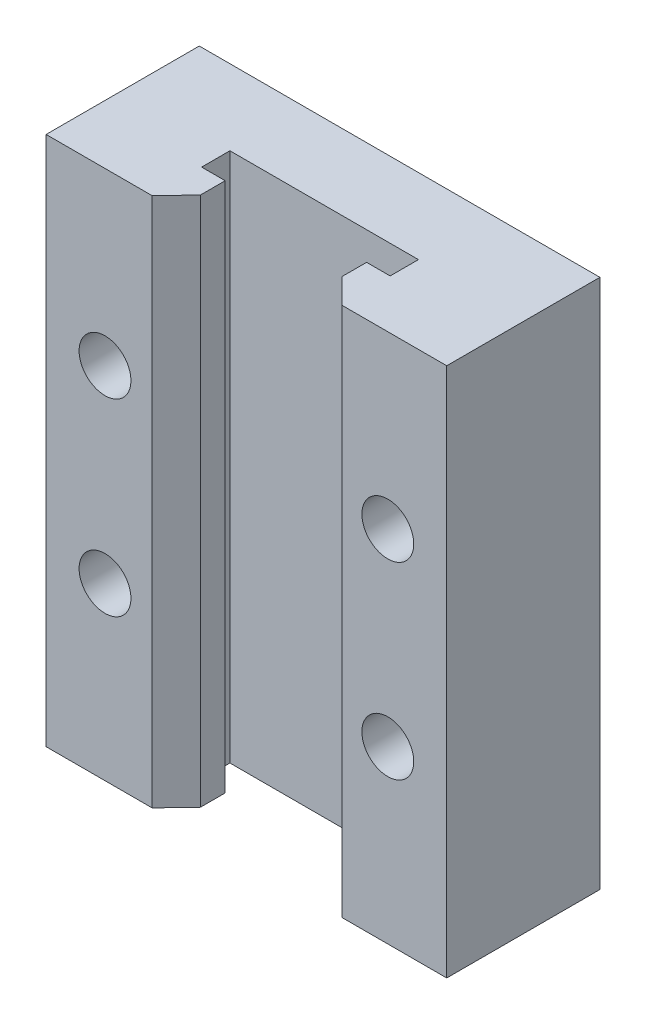
ISO-10303-21;
HEADER;
FILE_DESCRIPTION(('STEP AP214'),'2;1');
FILE_NAME('part.step','',(''),(''),'','','');
FILE_SCHEMA(('AUTOMOTIVE_DESIGN { 1 0 10303 214 1 1 1 1 }'));
ENDSEC;
DATA;
#1=APPLICATION_CONTEXT('core data for automotive mechanical design processes');
#2=APPLICATION_PROTOCOL_DEFINITION('international standard','automotive_design',2000,#1);
#3=PRODUCT_CONTEXT('',#1,'mechanical');
#4=PRODUCT('Part','Part','',(#3));
#5=PRODUCT_RELATED_PRODUCT_CATEGORY('part','',(#4));
#6=PRODUCT_DEFINITION_FORMATION('','',#4);
#7=PRODUCT_DEFINITION_CONTEXT('part definition',#1,'design');
#8=PRODUCT_DEFINITION('design','',#6,#7);
#9=PRODUCT_DEFINITION_SHAPE('','',#8);
#10=(LENGTH_UNIT() NAMED_UNIT(*) SI_UNIT(.MILLI.,.METRE.));
#11=(NAMED_UNIT(*) PLANE_ANGLE_UNIT() SI_UNIT($,.RADIAN.));
#12=(NAMED_UNIT(*) SI_UNIT($,.STERADIAN.) SOLID_ANGLE_UNIT());
#13=UNCERTAINTY_MEASURE_WITH_UNIT(LENGTH_MEASURE(1.E-05),#10,'distance_accuracy_value','');
#14=(GEOMETRIC_REPRESENTATION_CONTEXT(3) GLOBAL_UNCERTAINTY_ASSIGNED_CONTEXT((#13)) GLOBAL_UNIT_ASSIGNED_CONTEXT((#10,
#11,#12)) REPRESENTATION_CONTEXT('',''));
#15=CARTESIAN_POINT('',(0.,0.,0.));
#16=DIRECTION('',(0.,0.,1.));
#17=DIRECTION('',(1.,0.,0.));
#18=AXIS2_PLACEMENT_3D('',#15,#16,#17);
#19=CARTESIAN_POINT('',(-4.,22.5,-2.02488312466121));
#20=DIRECTION('',(-1.,0.,0.));
#21=DIRECTION('',(0.,0.,1.));
#22=AXIS2_PLACEMENT_3D('',#19,#20,#21);
#23=PLANE('',#22);
#24=DIRECTION('',(0.,0.,-1.));
#25=VECTOR('',#24,1.);
#26=CARTESIAN_POINT('',(-4.,0.,-2.02488312466121));
#27=LINE('',#26,#25);
#28=CARTESIAN_POINT('',(-4.,0.,-0.824883124661214));
#29=VERTEX_POINT('',#28);
#30=CARTESIAN_POINT('',(-4.,0.,-2.02488312466121));
#31=VERTEX_POINT('',#30);
#32=EDGE_CURVE('E171',#29,#31,#27,.T.);
#33=ORIENTED_EDGE('',*,*,#32,.T.);
#34=DIRECTION('',(0.,-1.,0.));
#35=VECTOR('',#34,1.);
#36=CARTESIAN_POINT('',(-4.,22.5,-2.02488312466121));
#37=LINE('',#36,#35);
#38=CARTESIAN_POINT('',(-4.,22.5,-2.02488312466121));
#39=VERTEX_POINT('',#38);
#40=EDGE_CURVE('E11',#39,#31,#37,.T.);
#41=ORIENTED_EDGE('',*,*,#40,.F.);
#42=DIRECTION('',(0.,0.,-1.));
#43=VECTOR('',#42,1.);
#44=CARTESIAN_POINT('',(-4.,22.5,-2.02488312466121));
#45=LINE('',#44,#43);
#46=CARTESIAN_POINT('',(-4.,22.5,-0.824883124661214));
#47=VERTEX_POINT('',#46);
#48=EDGE_CURVE('E198',#47,#39,#45,.T.);
#49=ORIENTED_EDGE('',*,*,#48,.F.);
#50=DIRECTION('',(0.,-1.,0.));
#51=VECTOR('',#50,1.);
#52=CARTESIAN_POINT('',(-4.,22.5,-0.824883124661214));
#53=LINE('',#52,#51);
#54=EDGE_CURVE('E167',#47,#29,#53,.T.);
#55=ORIENTED_EDGE('',*,*,#54,.T.);
#56=EDGE_LOOP('',(#33,#41,#49,#55));
#57=FACE_BOUND('',#56,.T.);
#58=ADVANCED_FACE('F37',(#57),#23,.F.);
#59=CARTESIAN_POINT('',(4.,22.5,-2.02488312466121));
#60=DIRECTION('',(0.,0.,-1.));
#61=DIRECTION('',(-1.,0.,0.));
#62=AXIS2_PLACEMENT_3D('',#59,#60,#61);
#63=PLANE('',#62);
#64=DIRECTION('',(1.,0.,0.));
#65=VECTOR('',#64,1.);
#66=CARTESIAN_POINT('',(4.,0.,-2.02488312466121));
#67=LINE('',#66,#65);
#68=CARTESIAN_POINT('',(4.,0.,-2.02488312466121));
#69=VERTEX_POINT('',#68);
#70=EDGE_CURVE('E174',#31,#69,#67,.T.);
#71=ORIENTED_EDGE('',*,*,#70,.T.);
#72=DIRECTION('',(0.,-1.,0.));
#73=VECTOR('',#72,1.);
#74=CARTESIAN_POINT('',(4.,22.5,-2.02488312466121));
#75=LINE('',#74,#73);
#76=CARTESIAN_POINT('',(4.,22.5,-2.02488312466121));
#77=VERTEX_POINT('',#76);
#78=EDGE_CURVE('E46',#77,#69,#75,.T.);
#79=ORIENTED_EDGE('',*,*,#78,.F.);
#80=DIRECTION('',(1.,0.,0.));
#81=VECTOR('',#80,1.);
#82=CARTESIAN_POINT('',(4.,22.5,-2.02488312466121));
#83=LINE('',#82,#81);
#84=EDGE_CURVE('E116',#39,#77,#83,.T.);
#85=ORIENTED_EDGE('',*,*,#84,.F.);
#86=ORIENTED_EDGE('',*,*,#40,.T.);
#87=EDGE_LOOP('',(#71,#79,#85,#86));
#88=FACE_BOUND('',#87,.T.);
#89=ADVANCED_FACE('F295',(#88),#63,.F.);
#90=CARTESIAN_POINT('',(4.,22.5,-2.02488312466121));
#91=DIRECTION('',(1.,0.,0.));
#92=DIRECTION('',(0.,0.,-1.));
#93=AXIS2_PLACEMENT_3D('',#90,#91,#92);
#94=PLANE('',#93);
#95=DIRECTION('',(0.,0.,1.));
#96=VECTOR('',#95,1.);
#97=CARTESIAN_POINT('',(4.,0.,-2.02488312466121));
#98=LINE('',#97,#96);
#99=CARTESIAN_POINT('',(4.,0.,-0.824883124661215));
#100=VERTEX_POINT('',#99);
#101=EDGE_CURVE('E177',#69,#100,#98,.T.);
#102=ORIENTED_EDGE('',*,*,#101,.T.);
#103=DIRECTION('',(0.,-1.,0.));
#104=VECTOR('',#103,1.);
#105=CARTESIAN_POINT('',(4.,22.5,-0.824883124661215));
#106=LINE('',#105,#104);
#107=CARTESIAN_POINT('',(4.,22.5,-0.824883124661215));
#108=VERTEX_POINT('',#107);
#109=EDGE_CURVE('E223',#108,#100,#106,.T.);
#110=ORIENTED_EDGE('',*,*,#109,.F.);
#111=DIRECTION('',(0.,0.,1.));
#112=VECTOR('',#111,1.);
#113=CARTESIAN_POINT('',(4.,22.5,-2.02488312466121));
#114=LINE('',#113,#112);
#115=EDGE_CURVE('E252',#77,#108,#114,.T.);
#116=ORIENTED_EDGE('',*,*,#115,.F.);
#117=ORIENTED_EDGE('',*,*,#78,.T.);
#118=EDGE_LOOP('',(#102,#110,#116,#117));
#119=FACE_BOUND('',#118,.T.);
#120=ADVANCED_FACE('F299',(#119),#94,.F.);
#121=CARTESIAN_POINT('',(4.,22.5,-0.824883124661215));
#122=DIRECTION('',(0.,0.,1.));
#123=DIRECTION('',(1.,0.,0.));
#124=AXIS2_PLACEMENT_3D('',#121,#122,#123);
#125=PLANE('',#124);
#126=DIRECTION('',(-1.,0.,0.));
#127=VECTOR('',#126,1.);
#128=CARTESIAN_POINT('',(4.,0.,-0.824883124661215));
#129=LINE('',#128,#127);
#130=CARTESIAN_POINT('',(3.,0.,-0.824883124661214));
#131=VERTEX_POINT('',#130);
#132=EDGE_CURVE('E179',#100,#131,#129,.T.);
#133=ORIENTED_EDGE('',*,*,#132,.T.);
#134=DIRECTION('',(0.,-1.,0.));
#135=VECTOR('',#134,1.);
#136=CARTESIAN_POINT('',(3.,22.5,-0.824883124661214));
#137=LINE('',#136,#135);
#138=CARTESIAN_POINT('',(3.,22.5,-0.824883124661214));
#139=VERTEX_POINT('',#138);
#140=EDGE_CURVE('E220',#139,#131,#137,.T.);
#141=ORIENTED_EDGE('',*,*,#140,.F.);
#142=DIRECTION('',(-1.,0.,0.));
#143=VECTOR('',#142,1.);
#144=CARTESIAN_POINT('',(4.,22.5,-0.824883124661215));
#145=LINE('',#144,#143);
#146=EDGE_CURVE('E254',#108,#139,#145,.T.);
#147=ORIENTED_EDGE('',*,*,#146,.F.);
#148=ORIENTED_EDGE('',*,*,#109,.T.);
#149=EDGE_LOOP('',(#133,#141,#147,#148));
#150=FACE_BOUND('',#149,.T.);
#151=ADVANCED_FACE('F303',(#150),#125,.F.);
#152=CARTESIAN_POINT('',(3.,22.5,-0.824883124661214));
#153=DIRECTION('',(1.,0.,0.));
#154=DIRECTION('',(0.,0.,-1.));
#155=AXIS2_PLACEMENT_3D('',#152,#153,#154);
#156=PLANE('',#155);
#157=DIRECTION('',(0.,0.,1.));
#158=VECTOR('',#157,1.);
#159=CARTESIAN_POINT('',(3.,0.,-0.824883124661214));
#160=LINE('',#159,#158);
#161=CARTESIAN_POINT('',(3.,0.,0.225116875338785));
#162=VERTEX_POINT('',#161);
#163=EDGE_CURVE('E181',#131,#162,#160,.T.);
#164=ORIENTED_EDGE('',*,*,#163,.T.);
#165=DIRECTION('',(0.,-1.,0.));
#166=VECTOR('',#165,1.);
#167=CARTESIAN_POINT('',(3.,22.5,0.225116875338785));
#168=LINE('',#167,#166);
#169=CARTESIAN_POINT('',(3.,22.5,0.225116875338785));
#170=VERTEX_POINT('',#169);
#171=EDGE_CURVE('E217',#170,#162,#168,.T.);
#172=ORIENTED_EDGE('',*,*,#171,.F.);
#173=DIRECTION('',(0.,0.,1.));
#174=VECTOR('',#173,1.);
#175=CARTESIAN_POINT('',(3.,22.5,-0.824883124661214));
#176=LINE('',#175,#174);
#177=EDGE_CURVE('E256',#139,#170,#176,.T.);
#178=ORIENTED_EDGE('',*,*,#177,.F.);
#179=ORIENTED_EDGE('',*,*,#140,.T.);
#180=EDGE_LOOP('',(#164,#172,#178,#179));
#181=FACE_BOUND('',#180,.T.);
#182=ADVANCED_FACE('F309',(#181),#156,.F.);
#183=CARTESIAN_POINT('',(3.,22.5,0.225116875338785));
#184=DIRECTION('',(0.707106781186539,0.,-0.707106781186556));
#185=DIRECTION('',(-0.707106781186556,0.,-0.707106781186539));
#186=AXIS2_PLACEMENT_3D('',#183,#184,#185);
#187=PLANE('',#186);
#188=DIRECTION('',(0.707106781186556,0.,0.707106781186539));
#189=VECTOR('',#188,1.);
#190=CARTESIAN_POINT('',(3.,0.,0.225116875338785));
#191=LINE('',#190,#189);
#192=CARTESIAN_POINT('',(4.05000000000003,0.,1.27511687533878));
#193=VERTEX_POINT('',#192);
#194=EDGE_CURVE('E183',#162,#193,#191,.T.);
#195=ORIENTED_EDGE('',*,*,#194,.T.);
#196=DIRECTION('',(0.,-1.,0.));
#197=VECTOR('',#196,1.);
#198=CARTESIAN_POINT('',(4.05000000000003,22.5,1.27511687533878));
#199=LINE('',#198,#197);
#200=CARTESIAN_POINT('',(4.05000000000003,22.5,1.27511687533878));
#201=VERTEX_POINT('',#200);
#202=EDGE_CURVE('E214',#201,#193,#199,.T.);
#203=ORIENTED_EDGE('',*,*,#202,.F.);
#204=DIRECTION('',(0.707106781186556,0.,0.707106781186539));
#205=VECTOR('',#204,1.);
#206=CARTESIAN_POINT('',(3.,22.5,0.225116875338785));
#207=LINE('',#206,#205);
#208=EDGE_CURVE('E258',#170,#201,#207,.T.);
#209=ORIENTED_EDGE('',*,*,#208,.F.);
#210=ORIENTED_EDGE('',*,*,#171,.T.);
#211=EDGE_LOOP('',(#195,#203,#209,#210));
#212=FACE_BOUND('',#211,.T.);
#213=ADVANCED_FACE('F313',(#212),#187,.F.);
#214=CARTESIAN_POINT('',(4.05000000000003,22.5,1.27511687533878));
#215=DIRECTION('',(0.,0.,-1.));
#216=DIRECTION('',(-1.,0.,0.));
#217=AXIS2_PLACEMENT_3D('',#214,#215,#216);
#218=PLANE('',#217);
#219=CARTESIAN_POINT('',(6.,7.25,1.27511687533878));
#220=DIRECTION('',(0.,0.,-1.));
#221=DIRECTION('',(-1.,0.,0.));
#222=AXIS2_PLACEMENT_3D('',#219,#220,#221);
#223=CIRCLE('',#222,1.1);
#224=CARTESIAN_POINT('',(4.9,7.25,1.27511687533878));
#225=VERTEX_POINT('',#224);
#226=EDGE_CURVE('E175',#225,#225,#223,.T.);
#227=ORIENTED_EDGE('',*,*,#226,.T.);
#228=EDGE_LOOP('',(#227));
#229=FACE_BOUND('',#228,.T.);
#230=CARTESIAN_POINT('',(6.,15.25,1.27511687533878));
#231=DIRECTION('',(0.,0.,-1.));
#232=DIRECTION('',(-1.,0.,0.));
#233=AXIS2_PLACEMENT_3D('',#230,#231,#232);
#234=CIRCLE('',#233,1.1);
#235=CARTESIAN_POINT('',(4.9,15.25,1.27511687533878));
#236=VERTEX_POINT('',#235);
#237=EDGE_CURVE('E233',#236,#236,#234,.T.);
#238=ORIENTED_EDGE('',*,*,#237,.T.);
#239=EDGE_LOOP('',(#238));
#240=FACE_BOUND('',#239,.T.);
#241=DIRECTION('',(1.,0.,0.));
#242=VECTOR('',#241,1.);
#243=CARTESIAN_POINT('',(4.05000000000003,0.,1.27511687533878));
#244=LINE('',#243,#242);
#245=CARTESIAN_POINT('',(8.5,0.,1.27511687533878));
#246=VERTEX_POINT('',#245);
#247=EDGE_CURVE('E185',#193,#246,#244,.T.);
#248=ORIENTED_EDGE('',*,*,#247,.T.);
#249=DIRECTION('',(0.,-1.,0.));
#250=VECTOR('',#249,1.);
#251=CARTESIAN_POINT('',(8.5,22.5,1.27511687533878));
#252=LINE('',#251,#250);
#253=CARTESIAN_POINT('',(8.5,22.5,1.27511687533878));
#254=VERTEX_POINT('',#253);
#255=EDGE_CURVE('E211',#254,#246,#252,.T.);
#256=ORIENTED_EDGE('',*,*,#255,.F.);
#257=DIRECTION('',(1.,0.,0.));
#258=VECTOR('',#257,1.);
#259=CARTESIAN_POINT('',(4.05000000000003,22.5,1.27511687533878));
#260=LINE('',#259,#258);
#261=EDGE_CURVE('E260',#201,#254,#260,.T.);
#262=ORIENTED_EDGE('',*,*,#261,.F.);
#263=ORIENTED_EDGE('',*,*,#202,.T.);
#264=EDGE_LOOP('',(#248,#256,#262,#263));
#265=FACE_BOUND('',#264,.T.);
#266=ADVANCED_FACE('F317',(#229,#240,#265),#218,.F.);
#267=CARTESIAN_POINT('',(8.5,22.5,1.27511687533878));
#268=DIRECTION('',(-1.,0.,0.));
#269=DIRECTION('',(0.,0.,1.));
#270=AXIS2_PLACEMENT_3D('',#267,#268,#269);
#271=PLANE('',#270);
#272=DIRECTION('',(0.,0.,-1.));
#273=VECTOR('',#272,1.);
#274=CARTESIAN_POINT('',(8.5,0.,1.27511687533878));
#275=LINE('',#274,#273);
#276=CARTESIAN_POINT('',(8.5,0.,-5.22488312466122));
#277=VERTEX_POINT('',#276);
#278=EDGE_CURVE('E187',#246,#277,#275,.T.);
#279=ORIENTED_EDGE('',*,*,#278,.T.);
#280=DIRECTION('',(0.,-1.,0.));
#281=VECTOR('',#280,1.);
#282=CARTESIAN_POINT('',(8.5,22.5,-5.22488312466122));
#283=LINE('',#282,#281);
#284=CARTESIAN_POINT('',(8.5,22.5,-5.22488312466122));
#285=VERTEX_POINT('',#284);
#286=EDGE_CURVE('E208',#285,#277,#283,.T.);
#287=ORIENTED_EDGE('',*,*,#286,.F.);
#288=DIRECTION('',(0.,0.,-1.));
#289=VECTOR('',#288,1.);
#290=CARTESIAN_POINT('',(8.5,22.5,1.27511687533878));
#291=LINE('',#290,#289);
#292=EDGE_CURVE('E262',#254,#285,#291,.T.);
#293=ORIENTED_EDGE('',*,*,#292,.F.);
#294=ORIENTED_EDGE('',*,*,#255,.T.);
#295=EDGE_LOOP('',(#279,#287,#293,#294));
#296=FACE_BOUND('',#295,.T.);
#297=ADVANCED_FACE('F321',(#296),#271,.F.);
#298=CARTESIAN_POINT('',(-8.5,22.5,-5.22488312466121));
#299=DIRECTION('',(0.,0.,1.));
#300=DIRECTION('',(1.,0.,0.));
#301=AXIS2_PLACEMENT_3D('',#298,#299,#300);
#302=PLANE('',#301);
#303=CARTESIAN_POINT('',(6.,7.25,-5.22488312466121));
#304=DIRECTION('',(0.,0.,-1.));
#305=DIRECTION('',(1.,0.,0.));
#306=AXIS2_PLACEMENT_3D('',#303,#304,#305);
#307=CIRCLE('',#306,1.1);
#308=CARTESIAN_POINT('',(7.1,7.25,-5.22488312466121));
#309=VERTEX_POINT('',#308);
#310=EDGE_CURVE('E244',#309,#309,#307,.T.);
#311=ORIENTED_EDGE('',*,*,#310,.F.);
#312=EDGE_LOOP('',(#311));
#313=FACE_BOUND('',#312,.T.);
#314=CARTESIAN_POINT('',(-6.,7.25,-5.22488312466121));
#315=DIRECTION('',(0.,0.,-1.));
#316=DIRECTION('',(-1.,0.,0.));
#317=AXIS2_PLACEMENT_3D('',#314,#315,#316);
#318=CIRCLE('',#317,1.1);
#319=CARTESIAN_POINT('',(-7.1,7.25,-5.22488312466121));
#320=VERTEX_POINT('',#319);
#321=EDGE_CURVE('E240',#320,#320,#318,.T.);
#322=ORIENTED_EDGE('',*,*,#321,.F.);
#323=EDGE_LOOP('',(#322));
#324=FACE_BOUND('',#323,.T.);
#325=CARTESIAN_POINT('',(-6.,15.25,-5.22488312466121));
#326=DIRECTION('',(0.,0.,-1.));
#327=DIRECTION('',(1.,0.,0.));
#328=AXIS2_PLACEMENT_3D('',#325,#326,#327);
#329=CIRCLE('',#328,1.1);
#330=CARTESIAN_POINT('',(-4.9,15.25,-5.22488312466121));
#331=VERTEX_POINT('',#330);
#332=EDGE_CURVE('E235',#331,#331,#329,.T.);
#333=ORIENTED_EDGE('',*,*,#332,.F.);
#334=EDGE_LOOP('',(#333));
#335=FACE_BOUND('',#334,.T.);
#336=CARTESIAN_POINT('',(6.,15.25,-5.22488312466121));
#337=DIRECTION('',(0.,0.,-1.));
#338=DIRECTION('',(-1.,0.,0.));
#339=AXIS2_PLACEMENT_3D('',#336,#337,#338);
#340=CIRCLE('',#339,1.1);
#341=CARTESIAN_POINT('',(4.9,15.25,-5.22488312466121));
#342=VERTEX_POINT('',#341);
#343=EDGE_CURVE('E229',#342,#342,#340,.T.);
#344=ORIENTED_EDGE('',*,*,#343,.F.);
#345=EDGE_LOOP('',(#344));
#346=FACE_BOUND('',#345,.T.);
#347=DIRECTION('',(-1.,0.,0.));
#348=VECTOR('',#347,1.);
#349=CARTESIAN_POINT('',(-8.5,0.,-5.22488312466121));
#350=LINE('',#349,#348);
#351=CARTESIAN_POINT('',(-8.5,0.,-5.22488312466121));
#352=VERTEX_POINT('',#351);
#353=EDGE_CURVE('E189',#277,#352,#350,.T.);
#354=ORIENTED_EDGE('',*,*,#353,.T.);
#355=DIRECTION('',(0.,-1.,0.));
#356=VECTOR('',#355,1.);
#357=CARTESIAN_POINT('',(-8.5,22.5,-5.22488312466121));
#358=LINE('',#357,#356);
#359=CARTESIAN_POINT('',(-8.5,22.5,-5.22488312466121));
#360=VERTEX_POINT('',#359);
#361=EDGE_CURVE('E205',#360,#352,#358,.T.);
#362=ORIENTED_EDGE('',*,*,#361,.F.);
#363=DIRECTION('',(-1.,0.,0.));
#364=VECTOR('',#363,1.);
#365=CARTESIAN_POINT('',(-8.5,22.5,-5.22488312466121));
#366=LINE('',#365,#364);
#367=EDGE_CURVE('E264',#285,#360,#366,.T.);
#368=ORIENTED_EDGE('',*,*,#367,.F.);
#369=ORIENTED_EDGE('',*,*,#286,.T.);
#370=EDGE_LOOP('',(#354,#362,#368,#369));
#371=FACE_BOUND('',#370,.T.);
#372=ADVANCED_FACE('F325',(#313,#324,#335,#346,#371),#302,.F.);
#373=CARTESIAN_POINT('',(-8.5,22.5,1.27511687533879));
#374=DIRECTION('',(1.,0.,0.));
#375=DIRECTION('',(0.,0.,-1.));
#376=AXIS2_PLACEMENT_3D('',#373,#374,#375);
#377=PLANE('',#376);
#378=DIRECTION('',(0.,0.,1.));
#379=VECTOR('',#378,1.);
#380=CARTESIAN_POINT('',(-8.5,0.,1.27511687533879));
#381=LINE('',#380,#379);
#382=CARTESIAN_POINT('',(-8.5,0.,1.27511687533879));
#383=VERTEX_POINT('',#382);
#384=EDGE_CURVE('E191',#352,#383,#381,.T.);
#385=ORIENTED_EDGE('',*,*,#384,.T.);
#386=DIRECTION('',(0.,-1.,0.));
#387=VECTOR('',#386,1.);
#388=CARTESIAN_POINT('',(-8.5,22.5,1.27511687533879));
#389=LINE('',#388,#387);
#390=CARTESIAN_POINT('',(-8.5,22.5,1.27511687533879));
#391=VERTEX_POINT('',#390);
#392=EDGE_CURVE('E202',#391,#383,#389,.T.);
#393=ORIENTED_EDGE('',*,*,#392,.F.);
#394=DIRECTION('',(0.,0.,1.));
#395=VECTOR('',#394,1.);
#396=CARTESIAN_POINT('',(-8.5,22.5,1.27511687533879));
#397=LINE('',#396,#395);
#398=EDGE_CURVE('E266',#360,#391,#397,.T.);
#399=ORIENTED_EDGE('',*,*,#398,.F.);
#400=ORIENTED_EDGE('',*,*,#361,.T.);
#401=EDGE_LOOP('',(#385,#393,#399,#400));
#402=FACE_BOUND('',#401,.T.);
#403=ADVANCED_FACE('F272',(#402),#377,.F.);
#404=CARTESIAN_POINT('',(-4.,22.5,1.27511687533878));
#405=DIRECTION('',(0.,0.,-1.));
#406=DIRECTION('',(-1.,0.,0.));
#407=AXIS2_PLACEMENT_3D('',#404,#405,#406);
#408=PLANE('',#407);
#409=CARTESIAN_POINT('',(-6.,7.25,1.27511687533878));
#410=DIRECTION('',(0.,0.,-1.));
#411=DIRECTION('',(-1.,0.,0.));
#412=AXIS2_PLACEMENT_3D('',#409,#410,#411);
#413=CIRCLE('',#412,1.1);
#414=CARTESIAN_POINT('',(-7.1,7.25,1.27511687533878));
#415=VERTEX_POINT('',#414);
#416=EDGE_CURVE('E40',#415,#415,#413,.T.);
#417=ORIENTED_EDGE('',*,*,#416,.T.);
#418=EDGE_LOOP('',(#417));
#419=FACE_BOUND('',#418,.T.);
#420=CARTESIAN_POINT('',(-6.,15.25,1.27511687533878));
#421=DIRECTION('',(0.,0.,-1.));
#422=DIRECTION('',(-1.,0.,0.));
#423=AXIS2_PLACEMENT_3D('',#420,#421,#422);
#424=CIRCLE('',#423,1.1);
#425=CARTESIAN_POINT('',(-7.1,15.25,1.27511687533878));
#426=VERTEX_POINT('',#425);
#427=EDGE_CURVE('E227',#426,#426,#424,.T.);
#428=ORIENTED_EDGE('',*,*,#427,.T.);
#429=EDGE_LOOP('',(#428));
#430=FACE_BOUND('',#429,.T.);
#431=DIRECTION('',(1.,0.,0.));
#432=VECTOR('',#431,1.);
#433=CARTESIAN_POINT('',(-4.,0.,1.27511687533878));
#434=LINE('',#433,#432);
#435=CARTESIAN_POINT('',(-4.,0.,1.27511687533878));
#436=VERTEX_POINT('',#435);
#437=EDGE_CURVE('E193',#383,#436,#434,.T.);
#438=ORIENTED_EDGE('',*,*,#437,.T.);
#439=DIRECTION('',(0.,-1.,0.));
#440=VECTOR('',#439,1.);
#441=CARTESIAN_POINT('',(-4.,22.5,1.27511687533878));
#442=LINE('',#441,#440);
#443=CARTESIAN_POINT('',(-4.,22.5,1.27511687533878));
#444=VERTEX_POINT('',#443);
#445=EDGE_CURVE('E162',#444,#436,#442,.T.);
#446=ORIENTED_EDGE('',*,*,#445,.F.);
#447=DIRECTION('',(1.,0.,0.));
#448=VECTOR('',#447,1.);
#449=CARTESIAN_POINT('',(-4.,22.5,1.27511687533878));
#450=LINE('',#449,#448);
#451=EDGE_CURVE('E153',#391,#444,#450,.T.);
#452=ORIENTED_EDGE('',*,*,#451,.F.);
#453=ORIENTED_EDGE('',*,*,#392,.T.);
#454=EDGE_LOOP('',(#438,#446,#452,#453));
#455=FACE_BOUND('',#454,.T.);
#456=ADVANCED_FACE('F276',(#419,#430,#455),#408,.F.);
#457=CARTESIAN_POINT('',(-3.,22.5,0.225116875338786));
#458=DIRECTION('',(-0.724137931034483,0.,-0.689655172413793));
#459=DIRECTION('',(-0.689655172413793,0.,0.724137931034483));
#460=AXIS2_PLACEMENT_3D('',#457,#458,#459);
#461=PLANE('',#460);
#462=DIRECTION('',(0.689655172413793,0.,-0.724137931034483));
#463=VECTOR('',#462,1.);
#464=CARTESIAN_POINT('',(-3.,0.,0.225116875338786));
#465=LINE('',#464,#463);
#466=CARTESIAN_POINT('',(-3.,0.,0.225116875338786));
#467=VERTEX_POINT('',#466);
#468=EDGE_CURVE('E161',#436,#467,#465,.T.);
#469=ORIENTED_EDGE('',*,*,#468,.T.);
#470=DIRECTION('',(0.,-1.,0.));
#471=VECTOR('',#470,1.);
#472=CARTESIAN_POINT('',(-3.,22.5,0.225116875338786));
#473=LINE('',#472,#471);
#474=CARTESIAN_POINT('',(-3.,22.5,0.225116875338786));
#475=VERTEX_POINT('',#474);
#476=EDGE_CURVE('E158',#475,#467,#473,.T.);
#477=ORIENTED_EDGE('',*,*,#476,.F.);
#478=DIRECTION('',(0.689655172413793,0.,-0.724137931034483));
#479=VECTOR('',#478,1.);
#480=CARTESIAN_POINT('',(-3.,22.5,0.225116875338786));
#481=LINE('',#480,#479);
#482=EDGE_CURVE('E147',#444,#475,#481,.T.);
#483=ORIENTED_EDGE('',*,*,#482,.F.);
#484=ORIENTED_EDGE('',*,*,#445,.T.);
#485=EDGE_LOOP('',(#469,#477,#483,#484));
#486=FACE_BOUND('',#485,.T.);
#487=ADVANCED_FACE('F159',(#486),#461,.F.);
#488=CARTESIAN_POINT('',(-3.,22.5,-0.824883124661213));
#489=DIRECTION('',(-1.,0.,0.));
#490=DIRECTION('',(0.,0.,1.));
#491=AXIS2_PLACEMENT_3D('',#488,#489,#490);
#492=PLANE('',#491);
#493=DIRECTION('',(0.,0.,-1.));
#494=VECTOR('',#493,1.);
#495=CARTESIAN_POINT('',(-3.,0.,-0.824883124661213));
#496=LINE('',#495,#494);
#497=CARTESIAN_POINT('',(-3.,0.,-0.824883124661213));
#498=VERTEX_POINT('',#497);
#499=EDGE_CURVE('E102',#467,#498,#496,.T.);
#500=ORIENTED_EDGE('',*,*,#499,.T.);
#501=DIRECTION('',(0.,-1.,0.));
#502=VECTOR('',#501,1.);
#503=CARTESIAN_POINT('',(-3.,22.5,-0.824883124661213));
#504=LINE('',#503,#502);
#505=CARTESIAN_POINT('',(-3.,22.5,-0.824883124661213));
#506=VERTEX_POINT('',#505);
#507=EDGE_CURVE('E163',#506,#498,#504,.T.);
#508=ORIENTED_EDGE('',*,*,#507,.F.);
#509=DIRECTION('',(0.,0.,-1.));
#510=VECTOR('',#509,1.);
#511=CARTESIAN_POINT('',(-3.,22.5,-0.824883124661213));
#512=LINE('',#511,#510);
#513=EDGE_CURVE('E151',#475,#506,#512,.T.);
#514=ORIENTED_EDGE('',*,*,#513,.F.);
#515=ORIENTED_EDGE('',*,*,#476,.T.);
#516=EDGE_LOOP('',(#500,#508,#514,#515));
#517=FACE_BOUND('',#516,.T.);
#518=ADVANCED_FACE('F165',(#517),#492,.F.);
#519=CARTESIAN_POINT('',(-4.,22.5,-0.824883124661214));
#520=DIRECTION('',(0.,0.,1.));
#521=DIRECTION('',(1.,0.,0.));
#522=AXIS2_PLACEMENT_3D('',#519,#520,#521);
#523=PLANE('',#522);
#524=DIRECTION('',(-1.,0.,0.));
#525=VECTOR('',#524,1.);
#526=CARTESIAN_POINT('',(-4.,0.,-0.824883124661214));
#527=LINE('',#526,#525);
#528=EDGE_CURVE('E108',#498,#29,#527,.T.);
#529=ORIENTED_EDGE('',*,*,#528,.T.);
#530=ORIENTED_EDGE('',*,*,#54,.F.);
#531=DIRECTION('',(-1.,0.,0.));
#532=VECTOR('',#531,1.);
#533=CARTESIAN_POINT('',(-4.,22.5,-0.824883124661214));
#534=LINE('',#533,#532);
#535=EDGE_CURVE('E55',#506,#47,#534,.T.);
#536=ORIENTED_EDGE('',*,*,#535,.F.);
#537=ORIENTED_EDGE('',*,*,#507,.T.);
#538=EDGE_LOOP('',(#529,#530,#536,#537));
#539=FACE_BOUND('',#538,.T.);
#540=ADVANCED_FACE('F284',(#539),#523,.F.);
#541=CARTESIAN_POINT('',(0.,22.5,0.));
#542=DIRECTION('',(0.,1.,0.));
#543=DIRECTION('',(0.,0.,1.));
#544=AXIS2_PLACEMENT_3D('',#541,#542,#543);
#545=PLANE('',#544);
#546=ORIENTED_EDGE('',*,*,#48,.T.);
#547=ORIENTED_EDGE('',*,*,#84,.T.);
#548=ORIENTED_EDGE('',*,*,#115,.T.);
#549=ORIENTED_EDGE('',*,*,#146,.T.);
#550=ORIENTED_EDGE('',*,*,#177,.T.);
#551=ORIENTED_EDGE('',*,*,#208,.T.);
#552=ORIENTED_EDGE('',*,*,#261,.T.);
#553=ORIENTED_EDGE('',*,*,#292,.T.);
#554=ORIENTED_EDGE('',*,*,#367,.T.);
#555=ORIENTED_EDGE('',*,*,#398,.T.);
#556=ORIENTED_EDGE('',*,*,#451,.T.);
#557=ORIENTED_EDGE('',*,*,#482,.T.);
#558=ORIENTED_EDGE('',*,*,#513,.T.);
#559=ORIENTED_EDGE('',*,*,#535,.T.);
#560=EDGE_LOOP('',(#546,#547,#548,#549,#550,#551,#552,#553,#554,#555,#556,#557,#558,#559));
#561=FACE_BOUND('',#560,.T.);
#562=ADVANCED_FACE('F149',(#561),#545,.T.);
#563=CARTESIAN_POINT('',(0.,0.,0.));
#564=DIRECTION('',(0.,1.,0.));
#565=DIRECTION('',(0.,0.,1.));
#566=AXIS2_PLACEMENT_3D('',#563,#564,#565);
#567=PLANE('',#566);
#568=ORIENTED_EDGE('',*,*,#32,.F.);
#569=ORIENTED_EDGE('',*,*,#528,.F.);
#570=ORIENTED_EDGE('',*,*,#499,.F.);
#571=ORIENTED_EDGE('',*,*,#468,.F.);
#572=ORIENTED_EDGE('',*,*,#437,.F.);
#573=ORIENTED_EDGE('',*,*,#384,.F.);
#574=ORIENTED_EDGE('',*,*,#353,.F.);
#575=ORIENTED_EDGE('',*,*,#278,.F.);
#576=ORIENTED_EDGE('',*,*,#247,.F.);
#577=ORIENTED_EDGE('',*,*,#194,.F.);
#578=ORIENTED_EDGE('',*,*,#163,.F.);
#579=ORIENTED_EDGE('',*,*,#132,.F.);
#580=ORIENTED_EDGE('',*,*,#101,.F.);
#581=ORIENTED_EDGE('',*,*,#70,.F.);
#582=EDGE_LOOP('',(#568,#569,#570,#571,#572,#573,#574,#575,#576,#577,#578,#579,#580,#581));
#583=FACE_BOUND('',#582,.T.);
#584=ADVANCED_FACE('F279',(#583),#567,.F.);
#585=CARTESIAN_POINT('',(-6.,15.25,4.77511687533879));
#586=DIRECTION('',(0.,0.,-1.));
#587=DIRECTION('',(-1.,0.,0.));
#588=AXIS2_PLACEMENT_3D('',#585,#586,#587);
#589=CYLINDRICAL_SURFACE('',#588,1.1);
#590=ORIENTED_EDGE('',*,*,#332,.T.);
#591=EDGE_LOOP('',(#590));
#592=FACE_BOUND('',#591,.T.);
#593=ORIENTED_EDGE('',*,*,#427,.F.);
#594=EDGE_LOOP('',(#593));
#595=FACE_BOUND('',#594,.T.);
#596=ADVANCED_FACE('F364',(#592,#595),#589,.F.);
#597=CARTESIAN_POINT('',(-6.,7.25,4.77511687533879));
#598=DIRECTION('',(0.,0.,-1.));
#599=DIRECTION('',(-1.,0.,0.));
#600=AXIS2_PLACEMENT_3D('',#597,#598,#599);
#601=CYLINDRICAL_SURFACE('',#600,1.1);
#602=ORIENTED_EDGE('',*,*,#321,.T.);
#603=EDGE_LOOP('',(#602));
#604=FACE_BOUND('',#603,.T.);
#605=ORIENTED_EDGE('',*,*,#416,.F.);
#606=EDGE_LOOP('',(#605));
#607=FACE_BOUND('',#606,.T.);
#608=ADVANCED_FACE('F391',(#604,#607),#601,.F.);
#609=CARTESIAN_POINT('',(6.,15.25,4.77511687533879));
#610=DIRECTION('',(0.,0.,-1.));
#611=DIRECTION('',(-1.,0.,0.));
#612=AXIS2_PLACEMENT_3D('',#609,#610,#611);
#613=CYLINDRICAL_SURFACE('',#612,1.1);
#614=ORIENTED_EDGE('',*,*,#343,.T.);
#615=EDGE_LOOP('',(#614));
#616=FACE_BOUND('',#615,.T.);
#617=ORIENTED_EDGE('',*,*,#237,.F.);
#618=EDGE_LOOP('',(#617));
#619=FACE_BOUND('',#618,.T.);
#620=ADVANCED_FACE('F401',(#616,#619),#613,.F.);
#621=CARTESIAN_POINT('',(6.,7.25,4.77511687533879));
#622=DIRECTION('',(0.,0.,-1.));
#623=DIRECTION('',(-1.,0.,0.));
#624=AXIS2_PLACEMENT_3D('',#621,#622,#623);
#625=CYLINDRICAL_SURFACE('',#624,1.1);
#626=ORIENTED_EDGE('',*,*,#310,.T.);
#627=EDGE_LOOP('',(#626));
#628=FACE_BOUND('',#627,.T.);
#629=ORIENTED_EDGE('',*,*,#226,.F.);
#630=EDGE_LOOP('',(#629));
#631=FACE_BOUND('',#630,.T.);
#632=ADVANCED_FACE('F411',(#628,#631),#625,.F.);
#633=CLOSED_SHELL('',(#58,#89,#120,#151,#182,#213,#266,#297,#372,#403,#456,#487,#518,#540,#562,
#584,#596,#608,#620,#632));
#634=MANIFOLD_SOLID_BREP('B2',#633);
#635=ADVANCED_BREP_SHAPE_REPRESENTATION('',(#18,#634),#14);
#636=SHAPE_DEFINITION_REPRESENTATION(#9,#635);
ENDSEC;
END-ISO-10303-21;
